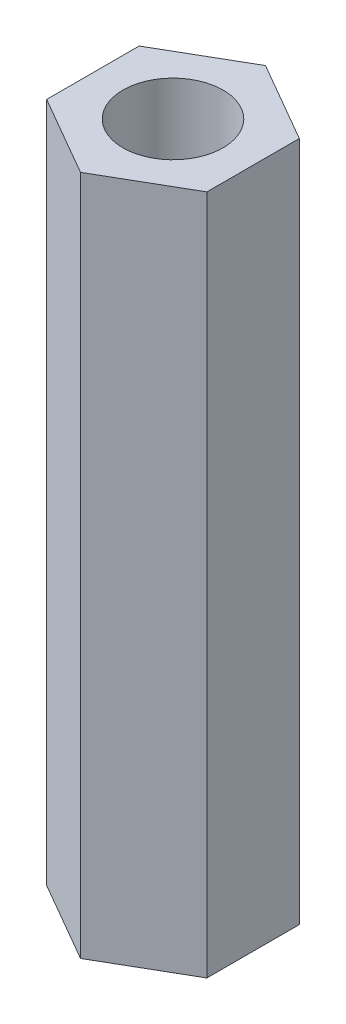
ISO-10303-21;
HEADER;
FILE_DESCRIPTION(('STEP AP214'),'2;1');
FILE_NAME('part.step','',(''),(''),'','','');
FILE_SCHEMA(('AUTOMOTIVE_DESIGN { 1 0 10303 214 1 1 1 1 }'));
ENDSEC;
DATA;
#1=APPLICATION_CONTEXT('core data for automotive mechanical design processes');
#2=APPLICATION_PROTOCOL_DEFINITION('international standard','automotive_design',2000,#1);
#3=PRODUCT_CONTEXT('',#1,'mechanical');
#4=PRODUCT('Part','Part','',(#3));
#5=PRODUCT_RELATED_PRODUCT_CATEGORY('part','',(#4));
#6=PRODUCT_DEFINITION_FORMATION('','',#4);
#7=PRODUCT_DEFINITION_CONTEXT('part definition',#1,'design');
#8=PRODUCT_DEFINITION('design','',#6,#7);
#9=PRODUCT_DEFINITION_SHAPE('','',#8);
#10=(LENGTH_UNIT() NAMED_UNIT(*) SI_UNIT(.MILLI.,.METRE.));
#11=(NAMED_UNIT(*) PLANE_ANGLE_UNIT() SI_UNIT($,.RADIAN.));
#12=(NAMED_UNIT(*) SI_UNIT($,.STERADIAN.) SOLID_ANGLE_UNIT());
#13=UNCERTAINTY_MEASURE_WITH_UNIT(LENGTH_MEASURE(1.E-05),#10,'distance_accuracy_value','');
#14=(GEOMETRIC_REPRESENTATION_CONTEXT(3) GLOBAL_UNCERTAINTY_ASSIGNED_CONTEXT((#13)) GLOBAL_UNIT_ASSIGNED_CONTEXT((#10,
#11,#12)) REPRESENTATION_CONTEXT('',''));
#15=CARTESIAN_POINT('',(0.,0.,0.));
#16=DIRECTION('',(0.,0.,1.));
#17=DIRECTION('',(1.,0.,0.));
#18=AXIS2_PLACEMENT_3D('',#15,#16,#17);
#19=CARTESIAN_POINT('',(0.,34.,0.));
#20=DIRECTION('',(0.,1.,0.));
#21=DIRECTION('',(0.,0.,1.));
#22=AXIS2_PLACEMENT_3D('',#19,#20,#21);
#23=PLANE('',#22);
#24=DIRECTION('',(-0.866025403784439,0.,-0.5));
#25=VECTOR('',#24,1.);
#26=CARTESIAN_POINT('',(4.,34.,-2.3094010767585));
#27=LINE('',#26,#25);
#28=CARTESIAN_POINT('',(4.,34.,-2.3094010767585));
#29=VERTEX_POINT('',#28);
#30=CARTESIAN_POINT('',(0.,34.,-4.618802153517));
#31=VERTEX_POINT('',#30);
#32=EDGE_CURVE('E131',#29,#31,#27,.T.);
#33=ORIENTED_EDGE('',*,*,#32,.T.);
#34=DIRECTION('',(-0.866025403784439,0.,0.5));
#35=VECTOR('',#34,1.);
#36=CARTESIAN_POINT('',(0.,34.,-4.618802153517));
#37=LINE('',#36,#35);
#38=CARTESIAN_POINT('',(-4.,34.,-2.3094010767585));
#39=VERTEX_POINT('',#38);
#40=EDGE_CURVE('E89',#31,#39,#37,.T.);
#41=ORIENTED_EDGE('',*,*,#40,.T.);
#42=DIRECTION('',(0.,0.,1.));
#43=VECTOR('',#42,1.);
#44=CARTESIAN_POINT('',(-4.,34.,-2.3094010767585));
#45=LINE('',#44,#43);
#46=CARTESIAN_POINT('',(-4.,34.,2.3094010767585));
#47=VERTEX_POINT('',#46);
#48=EDGE_CURVE('E102',#39,#47,#45,.T.);
#49=ORIENTED_EDGE('',*,*,#48,.T.);
#50=DIRECTION('',(0.866025403784439,0.,0.5));
#51=VECTOR('',#50,1.);
#52=CARTESIAN_POINT('',(-4.,34.,2.3094010767585));
#53=LINE('',#52,#51);
#54=CARTESIAN_POINT('',(0.,34.,4.61880215351701));
#55=VERTEX_POINT('',#54);
#56=EDGE_CURVE('E96',#47,#55,#53,.T.);
#57=ORIENTED_EDGE('',*,*,#56,.T.);
#58=DIRECTION('',(0.866025403784439,0.,-0.5));
#59=VECTOR('',#58,1.);
#60=CARTESIAN_POINT('',(0.,34.,4.61880215351701));
#61=LINE('',#60,#59);
#62=CARTESIAN_POINT('',(4.,34.,2.3094010767585));
#63=VERTEX_POINT('',#62);
#64=EDGE_CURVE('E100',#55,#63,#61,.T.);
#65=ORIENTED_EDGE('',*,*,#64,.T.);
#66=DIRECTION('',(0.,0.,-1.));
#67=VECTOR('',#66,1.);
#68=CARTESIAN_POINT('',(4.,34.,2.3094010767585));
#69=LINE('',#68,#67);
#70=EDGE_CURVE('E52',#63,#29,#69,.T.);
#71=ORIENTED_EDGE('',*,*,#70,.T.);
#72=EDGE_LOOP('',(#33,#41,#49,#57,#65,#71));
#73=FACE_BOUND('',#72,.T.);
#74=CARTESIAN_POINT('',(0.,34.,0.));
#75=DIRECTION('',(0.,1.,0.));
#76=DIRECTION('',(0.,0.,1.));
#77=AXIS2_PLACEMENT_3D('',#74,#75,#76);
#78=CIRCLE('',#77,2.5);
#79=CARTESIAN_POINT('',(0.,34.,2.5));
#80=VERTEX_POINT('',#79);
#81=EDGE_CURVE('E124',#80,#80,#78,.T.);
#82=ORIENTED_EDGE('',*,*,#81,.F.);
#83=EDGE_LOOP('',(#82));
#84=FACE_BOUND('',#83,.T.);
#85=ADVANCED_FACE('F35',(#73,#84),#23,.T.);
#86=CARTESIAN_POINT('',(0.,0.,0.));
#87=DIRECTION('',(0.,1.,0.));
#88=DIRECTION('',(0.,0.,1.));
#89=AXIS2_PLACEMENT_3D('',#86,#87,#88);
#90=PLANE('',#89);
#91=DIRECTION('',(-0.866025403784439,0.,-0.5));
#92=VECTOR('',#91,1.);
#93=CARTESIAN_POINT('',(4.,0.,-2.3094010767585));
#94=LINE('',#93,#92);
#95=CARTESIAN_POINT('',(4.,0.,-2.3094010767585));
#96=VERTEX_POINT('',#95);
#97=CARTESIAN_POINT('',(0.,0.,-4.618802153517));
#98=VERTEX_POINT('',#97);
#99=EDGE_CURVE('E120',#96,#98,#94,.T.);
#100=ORIENTED_EDGE('',*,*,#99,.F.);
#101=DIRECTION('',(0.,0.,-1.));
#102=VECTOR('',#101,1.);
#103=CARTESIAN_POINT('',(4.,0.,2.3094010767585));
#104=LINE('',#103,#102);
#105=CARTESIAN_POINT('',(4.,0.,2.3094010767585));
#106=VERTEX_POINT('',#105);
#107=EDGE_CURVE('E81',#106,#96,#104,.T.);
#108=ORIENTED_EDGE('',*,*,#107,.F.);
#109=DIRECTION('',(0.866025403784439,0.,-0.5));
#110=VECTOR('',#109,1.);
#111=CARTESIAN_POINT('',(0.,0.,4.61880215351701));
#112=LINE('',#111,#110);
#113=CARTESIAN_POINT('',(0.,0.,4.61880215351701));
#114=VERTEX_POINT('',#113);
#115=EDGE_CURVE('E75',#114,#106,#112,.T.);
#116=ORIENTED_EDGE('',*,*,#115,.F.);
#117=DIRECTION('',(0.866025403784439,0.,0.5));
#118=VECTOR('',#117,1.);
#119=CARTESIAN_POINT('',(-4.,0.,2.3094010767585));
#120=LINE('',#119,#118);
#121=CARTESIAN_POINT('',(-4.,0.,2.3094010767585));
#122=VERTEX_POINT('',#121);
#123=EDGE_CURVE('E110',#122,#114,#120,.T.);
#124=ORIENTED_EDGE('',*,*,#123,.F.);
#125=DIRECTION('',(0.,0.,1.));
#126=VECTOR('',#125,1.);
#127=CARTESIAN_POINT('',(-4.,0.,-2.3094010767585));
#128=LINE('',#127,#126);
#129=CARTESIAN_POINT('',(-4.,0.,-2.3094010767585));
#130=VERTEX_POINT('',#129);
#131=EDGE_CURVE('E126',#130,#122,#128,.T.);
#132=ORIENTED_EDGE('',*,*,#131,.F.);
#133=DIRECTION('',(-0.866025403784439,0.,0.5));
#134=VECTOR('',#133,1.);
#135=CARTESIAN_POINT('',(0.,0.,-4.618802153517));
#136=LINE('',#135,#134);
#137=EDGE_CURVE('E123',#98,#130,#136,.T.);
#138=ORIENTED_EDGE('',*,*,#137,.F.);
#139=EDGE_LOOP('',(#100,#108,#116,#124,#132,#138));
#140=FACE_BOUND('',#139,.T.);
#141=CARTESIAN_POINT('',(0.,0.,0.));
#142=DIRECTION('',(0.,1.,0.));
#143=DIRECTION('',(0.,0.,1.));
#144=AXIS2_PLACEMENT_3D('',#141,#142,#143);
#145=CIRCLE('',#144,2.5);
#146=CARTESIAN_POINT('',(0.,0.,2.5));
#147=VERTEX_POINT('',#146);
#148=EDGE_CURVE('E224',#147,#147,#145,.T.);
#149=ORIENTED_EDGE('',*,*,#148,.T.);
#150=EDGE_LOOP('',(#149));
#151=FACE_BOUND('',#150,.T.);
#152=ADVANCED_FACE('F140',(#140,#151),#90,.F.);
#153=CARTESIAN_POINT('',(4.,34.,-2.3094010767585));
#154=DIRECTION('',(-0.5,0.,0.866025403784439));
#155=DIRECTION('',(0.866025403784439,0.,0.5));
#156=AXIS2_PLACEMENT_3D('',#153,#154,#155);
#157=PLANE('',#156);
#158=ORIENTED_EDGE('',*,*,#99,.T.);
#159=DIRECTION('',(0.,-1.,0.));
#160=VECTOR('',#159,1.);
#161=CARTESIAN_POINT('',(0.,34.,-4.618802153517));
#162=LINE('',#161,#160);
#163=EDGE_CURVE('E11',#31,#98,#162,.T.);
#164=ORIENTED_EDGE('',*,*,#163,.F.);
#165=ORIENTED_EDGE('',*,*,#32,.F.);
#166=DIRECTION('',(0.,-1.,0.));
#167=VECTOR('',#166,1.);
#168=CARTESIAN_POINT('',(4.,34.,-2.3094010767585));
#169=LINE('',#168,#167);
#170=EDGE_CURVE('E116',#29,#96,#169,.T.);
#171=ORIENTED_EDGE('',*,*,#170,.T.);
#172=EDGE_LOOP('',(#158,#164,#165,#171));
#173=FACE_BOUND('',#172,.T.);
#174=ADVANCED_FACE('F37',(#173),#157,.F.);
#175=CARTESIAN_POINT('',(0.,34.,-4.618802153517));
#176=DIRECTION('',(0.5,0.,0.866025403784439));
#177=DIRECTION('',(0.866025403784439,0.,-0.5));
#178=AXIS2_PLACEMENT_3D('',#175,#176,#177);
#179=PLANE('',#178);
#180=ORIENTED_EDGE('',*,*,#137,.T.);
#181=DIRECTION('',(0.,-1.,0.));
#182=VECTOR('',#181,1.);
#183=CARTESIAN_POINT('',(-4.,34.,-2.3094010767585));
#184=LINE('',#183,#182);
#185=EDGE_CURVE('E44',#39,#130,#184,.T.);
#186=ORIENTED_EDGE('',*,*,#185,.F.);
#187=ORIENTED_EDGE('',*,*,#40,.F.);
#188=ORIENTED_EDGE('',*,*,#163,.T.);
#189=EDGE_LOOP('',(#180,#186,#187,#188));
#190=FACE_BOUND('',#189,.T.);
#191=ADVANCED_FACE('F165',(#190),#179,.F.);
#192=CARTESIAN_POINT('',(-4.,34.,-2.3094010767585));
#193=DIRECTION('',(1.,0.,0.));
#194=DIRECTION('',(0.,0.,-1.));
#195=AXIS2_PLACEMENT_3D('',#192,#193,#194);
#196=PLANE('',#195);
#197=ORIENTED_EDGE('',*,*,#131,.T.);
#198=DIRECTION('',(0.,-1.,0.));
#199=VECTOR('',#198,1.);
#200=CARTESIAN_POINT('',(-4.,34.,2.3094010767585));
#201=LINE('',#200,#199);
#202=EDGE_CURVE('E111',#47,#122,#201,.T.);
#203=ORIENTED_EDGE('',*,*,#202,.F.);
#204=ORIENTED_EDGE('',*,*,#48,.F.);
#205=ORIENTED_EDGE('',*,*,#185,.T.);
#206=EDGE_LOOP('',(#197,#203,#204,#205));
#207=FACE_BOUND('',#206,.T.);
#208=ADVANCED_FACE('F137',(#207),#196,.F.);
#209=CARTESIAN_POINT('',(-4.,34.,2.3094010767585));
#210=DIRECTION('',(0.5,0.,-0.866025403784439));
#211=DIRECTION('',(-0.866025403784439,0.,-0.5));
#212=AXIS2_PLACEMENT_3D('',#209,#210,#211);
#213=PLANE('',#212);
#214=ORIENTED_EDGE('',*,*,#123,.T.);
#215=DIRECTION('',(0.,-1.,0.));
#216=VECTOR('',#215,1.);
#217=CARTESIAN_POINT('',(0.,34.,4.61880215351701));
#218=LINE('',#217,#216);
#219=EDGE_CURVE('E107',#55,#114,#218,.T.);
#220=ORIENTED_EDGE('',*,*,#219,.F.);
#221=ORIENTED_EDGE('',*,*,#56,.F.);
#222=ORIENTED_EDGE('',*,*,#202,.T.);
#223=EDGE_LOOP('',(#214,#220,#221,#222));
#224=FACE_BOUND('',#223,.T.);
#225=ADVANCED_FACE('F108',(#224),#213,.F.);
#226=CARTESIAN_POINT('',(0.,34.,4.61880215351701));
#227=DIRECTION('',(-0.5,0.,-0.866025403784439));
#228=DIRECTION('',(-0.866025403784439,0.,0.5));
#229=AXIS2_PLACEMENT_3D('',#226,#227,#228);
#230=PLANE('',#229);
#231=ORIENTED_EDGE('',*,*,#115,.T.);
#232=DIRECTION('',(0.,-1.,0.));
#233=VECTOR('',#232,1.);
#234=CARTESIAN_POINT('',(4.,34.,2.3094010767585));
#235=LINE('',#234,#233);
#236=EDGE_CURVE('E112',#63,#106,#235,.T.);
#237=ORIENTED_EDGE('',*,*,#236,.F.);
#238=ORIENTED_EDGE('',*,*,#64,.F.);
#239=ORIENTED_EDGE('',*,*,#219,.T.);
#240=EDGE_LOOP('',(#231,#237,#238,#239));
#241=FACE_BOUND('',#240,.T.);
#242=ADVANCED_FACE('F114',(#241),#230,.F.);
#243=CARTESIAN_POINT('',(4.,34.,2.3094010767585));
#244=DIRECTION('',(-1.,0.,0.));
#245=DIRECTION('',(0.,0.,1.));
#246=AXIS2_PLACEMENT_3D('',#243,#244,#245);
#247=PLANE('',#246);
#248=ORIENTED_EDGE('',*,*,#107,.T.);
#249=ORIENTED_EDGE('',*,*,#170,.F.);
#250=ORIENTED_EDGE('',*,*,#70,.F.);
#251=ORIENTED_EDGE('',*,*,#236,.T.);
#252=EDGE_LOOP('',(#248,#249,#250,#251));
#253=FACE_BOUND('',#252,.T.);
#254=ADVANCED_FACE('F145',(#253),#247,.F.);
#255=CARTESIAN_POINT('',(0.,34.,0.));
#256=DIRECTION('',(0.,-1.,0.));
#257=DIRECTION('',(0.,0.,-1.));
#258=AXIS2_PLACEMENT_3D('',#255,#256,#257);
#259=CYLINDRICAL_SURFACE('',#258,2.5);
#260=ORIENTED_EDGE('',*,*,#81,.T.);
#261=EDGE_LOOP('',(#260));
#262=FACE_BOUND('',#261,.T.);
#263=ORIENTED_EDGE('',*,*,#148,.F.);
#264=EDGE_LOOP('',(#263));
#265=FACE_BOUND('',#264,.T.);
#266=ADVANCED_FACE('F147',(#262,#265),#259,.F.);
#267=CLOSED_SHELL('',(#85,#152,#174,#191,#208,#225,#242,#254,#266));
#268=MANIFOLD_SOLID_BREP('B2',#267);
#269=ADVANCED_BREP_SHAPE_REPRESENTATION('',(#18,#268),#14);
#270=SHAPE_DEFINITION_REPRESENTATION(#9,#269);
ENDSEC;
END-ISO-10303-21;
